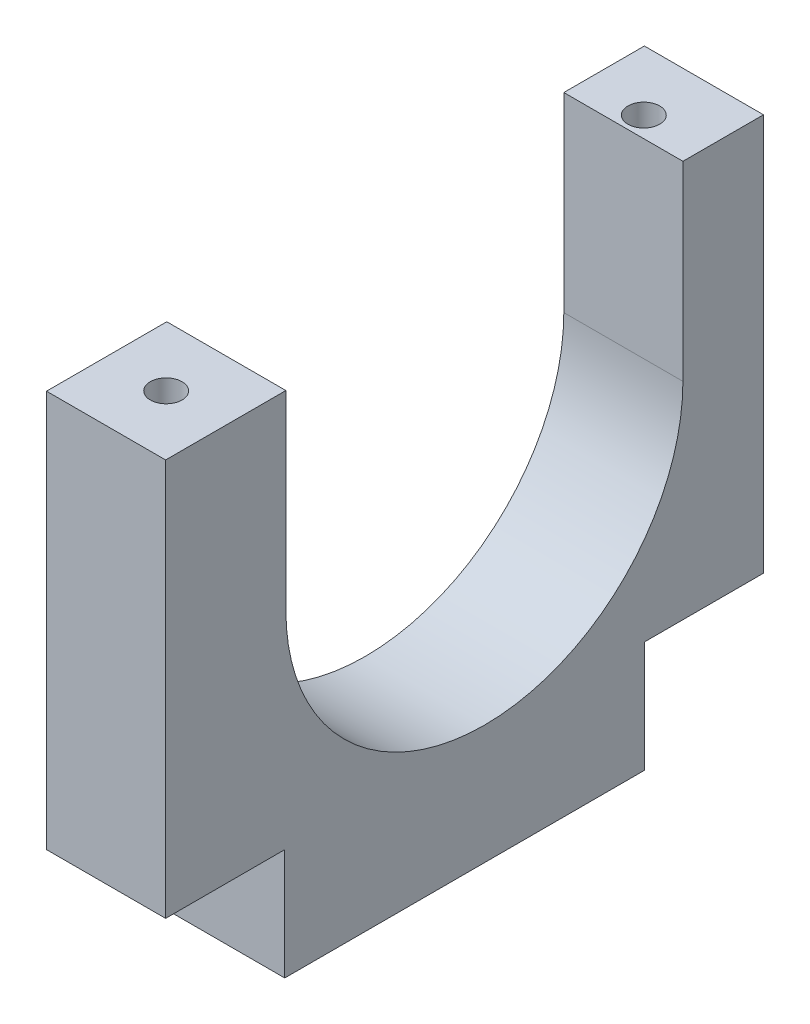
ISO-10303-21;
HEADER;
FILE_DESCRIPTION(('STEP AP214'),'2;1');
FILE_NAME('part.step','',(''),(''),'','','');
FILE_SCHEMA(('AUTOMOTIVE_DESIGN { 1 0 10303 214 1 1 1 1 }'));
ENDSEC;
DATA;
#1=APPLICATION_CONTEXT('core data for automotive mechanical design processes');
#2=APPLICATION_PROTOCOL_DEFINITION('international standard','automotive_design',2000,#1);
#3=PRODUCT_CONTEXT('',#1,'mechanical');
#4=PRODUCT('Part','Part','',(#3));
#5=PRODUCT_RELATED_PRODUCT_CATEGORY('part','',(#4));
#6=PRODUCT_DEFINITION_FORMATION('','',#4);
#7=PRODUCT_DEFINITION_CONTEXT('part definition',#1,'design');
#8=PRODUCT_DEFINITION('design','',#6,#7);
#9=PRODUCT_DEFINITION_SHAPE('','',#8);
#10=(LENGTH_UNIT() NAMED_UNIT(*) SI_UNIT(.MILLI.,.METRE.));
#11=(NAMED_UNIT(*) PLANE_ANGLE_UNIT() SI_UNIT($,.RADIAN.));
#12=(NAMED_UNIT(*) SI_UNIT($,.STERADIAN.) SOLID_ANGLE_UNIT());
#13=UNCERTAINTY_MEASURE_WITH_UNIT(LENGTH_MEASURE(1.E-05),#10,'distance_accuracy_value','');
#14=(GEOMETRIC_REPRESENTATION_CONTEXT(3) GLOBAL_UNCERTAINTY_ASSIGNED_CONTEXT((#13)) GLOBAL_UNIT_ASSIGNED_CONTEXT((#10,
#11,#12)) REPRESENTATION_CONTEXT('',''));
#15=CARTESIAN_POINT('',(0.,0.,0.));
#16=DIRECTION('',(0.,0.,1.));
#17=DIRECTION('',(1.,0.,0.));
#18=AXIS2_PLACEMENT_3D('',#15,#16,#17);
#19=CARTESIAN_POINT('',(0.,54.75,127.75));
#20=DIRECTION('',(0.,1.,0.));
#21=DIRECTION('',(0.,0.,-1.));
#22=AXIS2_PLACEMENT_3D('',#19,#20,#21);
#23=PLANE('',#22);
#24=CARTESIAN_POINT('',(-61.675,54.75,48.8374601018634));
#25=DIRECTION('',(0.,1.,0.));
#26=DIRECTION('',(0.,0.,1.));
#27=AXIS2_PLACEMENT_3D('',#24,#25,#26);
#28=CIRCLE('',#27,0.999999999999998);
#29=CARTESIAN_POINT('',(-61.675,54.75,49.8374601018634));
#30=VERTEX_POINT('',#29);
#31=EDGE_CURVE('E256',#30,#30,#28,.T.);
#32=ORIENTED_EDGE('',*,*,#31,.T.);
#33=EDGE_LOOP('',(#32));
#34=FACE_BOUND('',#33,.T.);
#35=CARTESIAN_POINT('',(-61.675,54.75,48.8374601018634));
#36=DIRECTION('',(0.,1.,0.));
#37=DIRECTION('',(0.,0.,1.));
#38=AXIS2_PLACEMENT_3D('',#35,#36,#37);
#39=CIRCLE('',#38,2.);
#40=CARTESIAN_POINT('',(-61.675,54.75,50.8374601018634));
#41=VERTEX_POINT('',#40);
#42=EDGE_CURVE('E11',#41,#41,#39,.T.);
#43=ORIENTED_EDGE('',*,*,#42,.F.);
#44=EDGE_LOOP('',(#43));
#45=FACE_BOUND('',#44,.T.);
#46=ADVANCED_FACE('F37',(#34,#45),#23,.F.);
#47=CARTESIAN_POINT('',(-57.925,54.75,52.5524601018634));
#48=DIRECTION('',(0.,0.,-1.));
#49=DIRECTION('',(-1.,0.,0.));
#50=AXIS2_PLACEMENT_3D('',#47,#48,#49);
#51=PLANE('',#50);
#52=DIRECTION('',(0.,-1.,0.));
#53=VECTOR('',#52,1.);
#54=CARTESIAN_POINT('',(-65.425,54.75,52.5524601018634));
#55=LINE('',#54,#53);
#56=CARTESIAN_POINT('',(-65.425,51.75,52.5524601018634));
#57=VERTEX_POINT('',#56);
#58=CARTESIAN_POINT('',(-65.425,44.75,52.5524601018634));
#59=VERTEX_POINT('',#58);
#60=EDGE_CURVE('E136',#57,#59,#55,.T.);
#61=ORIENTED_EDGE('',*,*,#60,.F.);
#62=DIRECTION('',(1.,0.,0.));
#63=VECTOR('',#62,1.);
#64=CARTESIAN_POINT('',(-57.925,51.75,52.5524601018634));
#65=LINE('',#64,#63);
#66=CARTESIAN_POINT('',(-57.925,51.75,52.5524601018634));
#67=VERTEX_POINT('',#66);
#68=EDGE_CURVE('E126',#57,#67,#65,.T.);
#69=ORIENTED_EDGE('',*,*,#68,.T.);
#70=DIRECTION('',(0.,-1.,0.));
#71=VECTOR('',#70,1.);
#72=CARTESIAN_POINT('',(-57.925,54.75,52.5524601018634));
#73=LINE('',#72,#71);
#74=CARTESIAN_POINT('',(-57.925,44.75,52.5524601018634));
#75=VERTEX_POINT('',#74);
#76=EDGE_CURVE('E59',#67,#75,#73,.T.);
#77=ORIENTED_EDGE('',*,*,#76,.T.);
#78=DIRECTION('',(1.,0.,0.));
#79=VECTOR('',#78,1.);
#80=CARTESIAN_POINT('',(-57.925,44.75,52.5524601018634));
#81=LINE('',#80,#79);
#82=EDGE_CURVE('E142',#59,#75,#81,.T.);
#83=ORIENTED_EDGE('',*,*,#82,.F.);
#84=EDGE_LOOP('',(#61,#69,#77,#83));
#85=FACE_BOUND('',#84,.T.);
#86=ADVANCED_FACE('F141',(#85),#51,.T.);
#87=CARTESIAN_POINT('',(0.,44.75,0.));
#88=DIRECTION('',(0.,1.,0.));
#89=DIRECTION('',(0.,0.,1.));
#90=AXIS2_PLACEMENT_3D('',#87,#88,#89);
#91=PLANE('',#90);
#92=ORIENTED_EDGE('',*,*,#82,.T.);
#93=DIRECTION('',(0.,0.,-1.));
#94=VECTOR('',#93,1.);
#95=CARTESIAN_POINT('',(-57.925,44.75,45.0524601018634));
#96=LINE('',#95,#94);
#97=CARTESIAN_POINT('',(-57.925,44.75,75.1975398981366));
#98=VERTEX_POINT('',#97);
#99=EDGE_CURVE('E218',#98,#75,#96,.T.);
#100=ORIENTED_EDGE('',*,*,#99,.F.);
#101=DIRECTION('',(1.,0.,0.));
#102=VECTOR('',#101,1.);
#103=CARTESIAN_POINT('',(-57.925,44.75,75.1975398981366));
#104=LINE('',#103,#102);
#105=CARTESIAN_POINT('',(-65.425,44.75,75.1975398981366));
#106=VERTEX_POINT('',#105);
#107=EDGE_CURVE('E170',#106,#98,#104,.T.);
#108=ORIENTED_EDGE('',*,*,#107,.F.);
#109=DIRECTION('',(0.,0.,-1.));
#110=VECTOR('',#109,1.);
#111=CARTESIAN_POINT('',(-65.425,44.75,45.0524601018634));
#112=LINE('',#111,#110);
#113=EDGE_CURVE('E216',#106,#59,#112,.T.);
#114=ORIENTED_EDGE('',*,*,#113,.T.);
#115=EDGE_LOOP('',(#92,#100,#108,#114));
#116=FACE_BOUND('',#115,.T.);
#117=ADVANCED_FACE('F279',(#116),#91,.F.);
#118=CARTESIAN_POINT('',(-57.925,54.75,75.1975398981366));
#119=DIRECTION('',(0.,0.,-1.));
#120=DIRECTION('',(-1.,0.,0.));
#121=AXIS2_PLACEMENT_3D('',#118,#119,#120);
#122=PLANE('',#121);
#123=DIRECTION('',(1.,0.,0.));
#124=VECTOR('',#123,1.);
#125=CARTESIAN_POINT('',(-57.925,51.75,75.1975398981366));
#126=LINE('',#125,#124);
#127=CARTESIAN_POINT('',(-65.425,51.75,75.1975398981366));
#128=VERTEX_POINT('',#127);
#129=CARTESIAN_POINT('',(-57.925,51.75,75.1975398981366));
#130=VERTEX_POINT('',#129);
#131=EDGE_CURVE('E164',#128,#130,#126,.T.);
#132=ORIENTED_EDGE('',*,*,#131,.F.);
#133=DIRECTION('',(0.,-1.,0.));
#134=VECTOR('',#133,1.);
#135=CARTESIAN_POINT('',(-65.425,54.75,75.1975398981366));
#136=LINE('',#135,#134);
#137=EDGE_CURVE('E173',#128,#106,#136,.T.);
#138=ORIENTED_EDGE('',*,*,#137,.T.);
#139=ORIENTED_EDGE('',*,*,#107,.T.);
#140=DIRECTION('',(0.,-1.,0.));
#141=VECTOR('',#140,1.);
#142=CARTESIAN_POINT('',(-57.925,54.75,75.1975398981366));
#143=LINE('',#142,#141);
#144=EDGE_CURVE('E174',#130,#98,#143,.T.);
#145=ORIENTED_EDGE('',*,*,#144,.F.);
#146=EDGE_LOOP('',(#132,#138,#139,#145));
#147=FACE_BOUND('',#146,.T.);
#148=ADVANCED_FACE('F295',(#147),#122,.F.);
#149=CARTESIAN_POINT('',(0.,54.75,0.));
#150=DIRECTION('',(0.,1.,0.));
#151=DIRECTION('',(0.,0.,1.));
#152=AXIS2_PLACEMENT_3D('',#149,#150,#151);
#153=PLANE('',#152);
#154=CARTESIAN_POINT('',(-61.675,54.75,78.9125398981366));
#155=DIRECTION('',(0.,-1.,0.));
#156=DIRECTION('',(0.,0.,-1.));
#157=AXIS2_PLACEMENT_3D('',#154,#155,#156);
#158=CIRCLE('',#157,0.999999999999998);
#159=CARTESIAN_POINT('',(-61.675,54.75,77.9125398981366));
#160=VERTEX_POINT('',#159);
#161=EDGE_CURVE('E167',#160,#160,#158,.T.);
#162=ORIENTED_EDGE('',*,*,#161,.F.);
#163=EDGE_LOOP('',(#162));
#164=FACE_BOUND('',#163,.T.);
#165=CARTESIAN_POINT('',(-61.675,54.75,78.9125398981366));
#166=DIRECTION('',(0.,-1.,0.));
#167=DIRECTION('',(0.,0.,-1.));
#168=AXIS2_PLACEMENT_3D('',#165,#166,#167);
#169=CIRCLE('',#168,2.);
#170=CARTESIAN_POINT('',(-61.675,54.75,76.9125398981366));
#171=VERTEX_POINT('',#170);
#172=EDGE_CURVE('E144',#171,#171,#169,.T.);
#173=ORIENTED_EDGE('',*,*,#172,.T.);
#174=EDGE_LOOP('',(#173));
#175=FACE_BOUND('',#174,.T.);
#176=ADVANCED_FACE('F292',(#164,#175),#153,.F.);
#177=CARTESIAN_POINT('',(-70.425,64.75,62.625));
#178=DIRECTION('',(1.,0.,0.));
#179=DIRECTION('',(0.,0.,-1.));
#180=AXIS2_PLACEMENT_3D('',#177,#178,#179);
#181=CYLINDRICAL_SURFACE('',#180,12.5);
#182=DIRECTION('',(1.,0.,0.));
#183=VECTOR('',#182,1.);
#184=CARTESIAN_POINT('',(-70.425,64.75,75.125));
#185=LINE('',#184,#183);
#186=CARTESIAN_POINT('',(-65.425,64.75,75.125));
#187=VERTEX_POINT('',#186);
#188=CARTESIAN_POINT('',(-57.925,64.75,75.125));
#189=VERTEX_POINT('',#188);
#190=EDGE_CURVE('E229',#187,#189,#185,.T.);
#191=ORIENTED_EDGE('',*,*,#190,.T.);
#192=CARTESIAN_POINT('',(-57.925,64.75,62.625));
#193=DIRECTION('',(-1.,0.,0.));
#194=DIRECTION('',(0.,0.,1.));
#195=AXIS2_PLACEMENT_3D('',#192,#193,#194);
#196=CIRCLE('',#195,12.5);
#197=CARTESIAN_POINT('',(-57.925,64.75,50.125));
#198=VERTEX_POINT('',#197);
#199=EDGE_CURVE('E221',#198,#189,#196,.T.);
#200=ORIENTED_EDGE('',*,*,#199,.F.);
#201=DIRECTION('',(1.,0.,0.));
#202=VECTOR('',#201,1.);
#203=CARTESIAN_POINT('',(-70.425,64.75,50.125));
#204=LINE('',#203,#202);
#205=CARTESIAN_POINT('',(-65.425,64.75,50.125));
#206=VERTEX_POINT('',#205);
#207=EDGE_CURVE('E45',#198,#206,#204,.F.);
#208=ORIENTED_EDGE('',*,*,#207,.T.);
#209=CARTESIAN_POINT('',(-65.425,64.75,62.625));
#210=DIRECTION('',(-1.,0.,0.));
#211=DIRECTION('',(0.,0.,1.));
#212=AXIS2_PLACEMENT_3D('',#209,#210,#211);
#213=CIRCLE('',#212,12.5);
#214=EDGE_CURVE('E224',#187,#206,#213,.F.);
#215=ORIENTED_EDGE('',*,*,#214,.F.);
#216=EDGE_LOOP('',(#191,#200,#208,#215));
#217=FACE_BOUND('',#216,.T.);
#218=ADVANCED_FACE('F237',(#217),#181,.F.);
#219=CARTESIAN_POINT('',(-65.425,-35.9364248901641,45.0524601018634));
#220=DIRECTION('',(0.,0.,1.));
#221=DIRECTION('',(1.,0.,0.));
#222=AXIS2_PLACEMENT_3D('',#219,#220,#221);
#223=PLANE('',#222);
#224=DIRECTION('',(0.,1.,0.));
#225=VECTOR('',#224,1.);
#226=CARTESIAN_POINT('',(-57.925,-35.9364248901641,45.0524601018634));
#227=LINE('',#226,#225);
#228=CARTESIAN_POINT('',(-57.925,51.75,45.0524601018634));
#229=VERTEX_POINT('',#228);
#230=CARTESIAN_POINT('',(-57.925,76.75,45.0524601018634));
#231=VERTEX_POINT('',#230);
#232=EDGE_CURVE('E227',#229,#231,#227,.T.);
#233=ORIENTED_EDGE('',*,*,#232,.F.);
#234=DIRECTION('',(-1.,0.,0.));
#235=VECTOR('',#234,1.);
#236=CARTESIAN_POINT('',(-57.925,51.75,45.0524601018634));
#237=LINE('',#236,#235);
#238=CARTESIAN_POINT('',(-65.425,51.75,45.0524601018634));
#239=VERTEX_POINT('',#238);
#240=EDGE_CURVE('E139',#229,#239,#237,.T.);
#241=ORIENTED_EDGE('',*,*,#240,.T.);
#242=DIRECTION('',(0.,1.,0.));
#243=VECTOR('',#242,1.);
#244=CARTESIAN_POINT('',(-65.425,-35.9364248901641,45.0524601018634));
#245=LINE('',#244,#243);
#246=CARTESIAN_POINT('',(-65.425,76.75,45.0524601018634));
#247=VERTEX_POINT('',#246);
#248=EDGE_CURVE('E138',#239,#247,#245,.T.);
#249=ORIENTED_EDGE('',*,*,#248,.T.);
#250=DIRECTION('',(-1.,0.,0.));
#251=VECTOR('',#250,1.);
#252=CARTESIAN_POINT('',(-57.925,76.75,45.0524601018634));
#253=LINE('',#252,#251);
#254=EDGE_CURVE('E193',#231,#247,#253,.T.);
#255=ORIENTED_EDGE('',*,*,#254,.F.);
#256=EDGE_LOOP('',(#233,#241,#249,#255));
#257=FACE_BOUND('',#256,.T.);
#258=ADVANCED_FACE('F255',(#257),#223,.F.);
#259=CARTESIAN_POINT('',(-65.425,-35.9364248901641,45.0524601018634));
#260=DIRECTION('',(-1.,0.,0.));
#261=DIRECTION('',(0.,0.,1.));
#262=AXIS2_PLACEMENT_3D('',#259,#260,#261);
#263=PLANE('',#262);
#264=ORIENTED_EDGE('',*,*,#248,.F.);
#265=DIRECTION('',(0.,0.,1.));
#266=VECTOR('',#265,1.);
#267=CARTESIAN_POINT('',(-65.425,51.75,45.0524601018634));
#268=LINE('',#267,#266);
#269=EDGE_CURVE('E129',#239,#57,#268,.T.);
#270=ORIENTED_EDGE('',*,*,#269,.T.);
#271=ORIENTED_EDGE('',*,*,#60,.T.);
#272=ORIENTED_EDGE('',*,*,#113,.F.);
#273=ORIENTED_EDGE('',*,*,#137,.F.);
#274=DIRECTION('',(0.,0.,-1.));
#275=VECTOR('',#274,1.);
#276=CARTESIAN_POINT('',(-65.425,51.75,82.6975398981366));
#277=LINE('',#276,#275);
#278=CARTESIAN_POINT('',(-65.425,51.75,82.6975398981366));
#279=VERTEX_POINT('',#278);
#280=EDGE_CURVE('E161',#279,#128,#277,.T.);
#281=ORIENTED_EDGE('',*,*,#280,.F.);
#282=DIRECTION('',(0.,-1.,0.));
#283=VECTOR('',#282,1.);
#284=CARTESIAN_POINT('',(-65.425,84.655694150421,82.6975398981366));
#285=LINE('',#284,#283);
#286=CARTESIAN_POINT('',(-65.425,76.75,82.6975398981366));
#287=VERTEX_POINT('',#286);
#288=EDGE_CURVE('E183',#287,#279,#285,.T.);
#289=ORIENTED_EDGE('',*,*,#288,.F.);
#290=DIRECTION('',(0.,0.,1.));
#291=VECTOR('',#290,1.);
#292=CARTESIAN_POINT('',(-65.425,76.75,80.1975398981366));
#293=LINE('',#292,#291);
#294=CARTESIAN_POINT('',(-65.425,76.75,75.125));
#295=VERTEX_POINT('',#294);
#296=EDGE_CURVE('E209',#295,#287,#293,.T.);
#297=ORIENTED_EDGE('',*,*,#296,.F.);
#298=DIRECTION('',(0.,-1.,0.));
#299=VECTOR('',#298,1.);
#300=CARTESIAN_POINT('',(-65.425,76.75,75.125));
#301=LINE('',#300,#299);
#302=EDGE_CURVE('E211',#295,#187,#301,.T.);
#303=ORIENTED_EDGE('',*,*,#302,.T.);
#304=ORIENTED_EDGE('',*,*,#214,.T.);
#305=DIRECTION('',(0.,-1.,0.));
#306=VECTOR('',#305,1.);
#307=CARTESIAN_POINT('',(-65.425,76.75,50.125));
#308=LINE('',#307,#306);
#309=CARTESIAN_POINT('',(-65.425,76.75,50.125));
#310=VERTEX_POINT('',#309);
#311=EDGE_CURVE('E202',#310,#206,#308,.T.);
#312=ORIENTED_EDGE('',*,*,#311,.F.);
#313=DIRECTION('',(0.,0.,1.));
#314=VECTOR('',#313,1.);
#315=CARTESIAN_POINT('',(-65.425,76.75,50.125));
#316=LINE('',#315,#314);
#317=EDGE_CURVE('E196',#247,#310,#316,.T.);
#318=ORIENTED_EDGE('',*,*,#317,.F.);
#319=EDGE_LOOP('',(#264,#270,#271,#272,#273,#281,#289,#297,#303,#304,#312,#318));
#320=FACE_BOUND('',#319,.T.);
#321=ADVANCED_FACE('F134',(#320),#263,.T.);
#322=CARTESIAN_POINT('',(-57.925,-35.9364248901641,45.0524601018634));
#323=DIRECTION('',(-1.,0.,0.));
#324=DIRECTION('',(0.,0.,1.));
#325=AXIS2_PLACEMENT_3D('',#322,#323,#324);
#326=PLANE('',#325);
#327=DIRECTION('',(0.,0.,-1.));
#328=VECTOR('',#327,1.);
#329=CARTESIAN_POINT('',(-57.925,51.75,45.0524601018634));
#330=LINE('',#329,#328);
#331=EDGE_CURVE('E52',#67,#229,#330,.T.);
#332=ORIENTED_EDGE('',*,*,#331,.T.);
#333=ORIENTED_EDGE('',*,*,#232,.T.);
#334=DIRECTION('',(0.,0.,-1.));
#335=VECTOR('',#334,1.);
#336=CARTESIAN_POINT('',(-57.925,76.75,50.125));
#337=LINE('',#336,#335);
#338=CARTESIAN_POINT('',(-57.925,76.75,50.125));
#339=VERTEX_POINT('',#338);
#340=EDGE_CURVE('E187',#339,#231,#337,.T.);
#341=ORIENTED_EDGE('',*,*,#340,.F.);
#342=DIRECTION('',(0.,-1.,0.));
#343=VECTOR('',#342,1.);
#344=CARTESIAN_POINT('',(-57.925,76.75,50.125));
#345=LINE('',#344,#343);
#346=EDGE_CURVE('E200',#339,#198,#345,.T.);
#347=ORIENTED_EDGE('',*,*,#346,.T.);
#348=ORIENTED_EDGE('',*,*,#199,.T.);
#349=DIRECTION('',(0.,-1.,0.));
#350=VECTOR('',#349,1.);
#351=CARTESIAN_POINT('',(-57.925,76.75,75.125));
#352=LINE('',#351,#350);
#353=CARTESIAN_POINT('',(-57.925,76.75,75.125));
#354=VERTEX_POINT('',#353);
#355=EDGE_CURVE('E214',#354,#189,#352,.T.);
#356=ORIENTED_EDGE('',*,*,#355,.F.);
#357=DIRECTION('',(0.,0.,-1.));
#358=VECTOR('',#357,1.);
#359=CARTESIAN_POINT('',(-57.925,76.75,80.1975398981366));
#360=LINE('',#359,#358);
#361=CARTESIAN_POINT('',(-57.925,76.75,82.6975398981366));
#362=VERTEX_POINT('',#361);
#363=EDGE_CURVE('E204',#362,#354,#360,.T.);
#364=ORIENTED_EDGE('',*,*,#363,.F.);
#365=DIRECTION('',(0.,-1.,0.));
#366=VECTOR('',#365,1.);
#367=CARTESIAN_POINT('',(-57.925,84.655694150421,82.6975398981366));
#368=LINE('',#367,#366);
#369=CARTESIAN_POINT('',(-57.925,51.75,82.6975398981366));
#370=VERTEX_POINT('',#369);
#371=EDGE_CURVE('E188',#362,#370,#368,.T.);
#372=ORIENTED_EDGE('',*,*,#371,.T.);
#373=DIRECTION('',(0.,0.,1.));
#374=VECTOR('',#373,1.);
#375=CARTESIAN_POINT('',(-57.925,51.75,82.6975398981366));
#376=LINE('',#375,#374);
#377=EDGE_CURVE('E154',#130,#370,#376,.T.);
#378=ORIENTED_EDGE('',*,*,#377,.F.);
#379=ORIENTED_EDGE('',*,*,#144,.T.);
#380=ORIENTED_EDGE('',*,*,#99,.T.);
#381=ORIENTED_EDGE('',*,*,#76,.F.);
#382=EDGE_LOOP('',(#332,#333,#341,#347,#348,#356,#364,#372,#378,#379,#380,#381));
#383=FACE_BOUND('',#382,.T.);
#384=ADVANCED_FACE('F39',(#383),#326,.F.);
#385=CARTESIAN_POINT('',(-57.925,76.75,75.125));
#386=DIRECTION('',(0.,0.,1.));
#387=DIRECTION('',(1.,0.,0.));
#388=AXIS2_PLACEMENT_3D('',#385,#386,#387);
#389=PLANE('',#388);
#390=ORIENTED_EDGE('',*,*,#190,.F.);
#391=ORIENTED_EDGE('',*,*,#302,.F.);
#392=DIRECTION('',(-1.,0.,0.));
#393=VECTOR('',#392,1.);
#394=CARTESIAN_POINT('',(-57.925,76.75,75.125));
#395=LINE('',#394,#393);
#396=EDGE_CURVE('E207',#354,#295,#395,.T.);
#397=ORIENTED_EDGE('',*,*,#396,.F.);
#398=ORIENTED_EDGE('',*,*,#355,.T.);
#399=EDGE_LOOP('',(#390,#391,#397,#398));
#400=FACE_BOUND('',#399,.T.);
#401=ADVANCED_FACE('F246',(#400),#389,.F.);
#402=CARTESIAN_POINT('',(0.,76.75,0.));
#403=DIRECTION('',(0.,1.,0.));
#404=DIRECTION('',(0.,0.,1.));
#405=AXIS2_PLACEMENT_3D('',#402,#403,#404);
#406=PLANE('',#405);
#407=CARTESIAN_POINT('',(-61.675,76.75,78.9125398981366));
#408=DIRECTION('',(0.,-1.,0.));
#409=DIRECTION('',(0.,0.,-1.));
#410=AXIS2_PLACEMENT_3D('',#407,#408,#409);
#411=CIRCLE('',#410,0.999999999999998);
#412=CARTESIAN_POINT('',(-61.675,76.75,77.9125398981366));
#413=VERTEX_POINT('',#412);
#414=EDGE_CURVE('E180',#413,#413,#411,.T.);
#415=ORIENTED_EDGE('',*,*,#414,.T.);
#416=EDGE_LOOP('',(#415));
#417=FACE_BOUND('',#416,.T.);
#418=ORIENTED_EDGE('',*,*,#363,.T.);
#419=ORIENTED_EDGE('',*,*,#396,.T.);
#420=ORIENTED_EDGE('',*,*,#296,.T.);
#421=DIRECTION('',(1.,0.,0.));
#422=VECTOR('',#421,1.);
#423=CARTESIAN_POINT('',(0.,76.75,82.6975398981366));
#424=LINE('',#423,#422);
#425=EDGE_CURVE('E184',#287,#362,#424,.T.);
#426=ORIENTED_EDGE('',*,*,#425,.T.);
#427=EDGE_LOOP('',(#418,#419,#420,#426));
#428=FACE_BOUND('',#427,.T.);
#429=ADVANCED_FACE('F316',(#417,#428),#406,.T.);
#430=CARTESIAN_POINT('',(-57.925,76.75,50.125));
#431=DIRECTION('',(0.,0.,-1.));
#432=DIRECTION('',(-1.,0.,0.));
#433=AXIS2_PLACEMENT_3D('',#430,#431,#432);
#434=PLANE('',#433);
#435=ORIENTED_EDGE('',*,*,#207,.F.);
#436=ORIENTED_EDGE('',*,*,#346,.F.);
#437=DIRECTION('',(1.,0.,0.));
#438=VECTOR('',#437,1.);
#439=CARTESIAN_POINT('',(-57.925,76.75,50.125));
#440=LINE('',#439,#438);
#441=EDGE_CURVE('E198',#310,#339,#440,.T.);
#442=ORIENTED_EDGE('',*,*,#441,.F.);
#443=ORIENTED_EDGE('',*,*,#311,.T.);
#444=EDGE_LOOP('',(#435,#436,#442,#443));
#445=FACE_BOUND('',#444,.T.);
#446=ADVANCED_FACE('F250',(#445),#434,.F.);
#447=CARTESIAN_POINT('',(0.,76.75,0.));
#448=DIRECTION('',(0.,1.,0.));
#449=DIRECTION('',(0.,0.,1.));
#450=AXIS2_PLACEMENT_3D('',#447,#448,#449);
#451=PLANE('',#450);
#452=CARTESIAN_POINT('',(-61.675,76.75,48.8374601018634));
#453=DIRECTION('',(0.,1.,0.));
#454=DIRECTION('',(0.,0.,1.));
#455=AXIS2_PLACEMENT_3D('',#452,#453,#454);
#456=CIRCLE('',#455,0.999999999999998);
#457=CARTESIAN_POINT('',(-61.675,76.75,49.8374601018634));
#458=VERTEX_POINT('',#457);
#459=EDGE_CURVE('E176',#458,#458,#456,.T.);
#460=ORIENTED_EDGE('',*,*,#459,.F.);
#461=EDGE_LOOP('',(#460));
#462=FACE_BOUND('',#461,.T.);
#463=ORIENTED_EDGE('',*,*,#340,.T.);
#464=ORIENTED_EDGE('',*,*,#254,.T.);
#465=ORIENTED_EDGE('',*,*,#317,.T.);
#466=ORIENTED_EDGE('',*,*,#441,.T.);
#467=EDGE_LOOP('',(#463,#464,#465,#466));
#468=FACE_BOUND('',#467,.T.);
#469=ADVANCED_FACE('F252',(#462,#468),#451,.T.);
#470=CARTESIAN_POINT('',(0.,84.655694150421,82.6975398981366));
#471=DIRECTION('',(0.,0.,-1.));
#472=DIRECTION('',(-1.,0.,0.));
#473=AXIS2_PLACEMENT_3D('',#470,#471,#472);
#474=PLANE('',#473);
#475=ORIENTED_EDGE('',*,*,#288,.T.);
#476=DIRECTION('',(-1.,0.,0.));
#477=VECTOR('',#476,1.);
#478=CARTESIAN_POINT('',(-57.925,51.75,82.6975398981366));
#479=LINE('',#478,#477);
#480=EDGE_CURVE('E158',#370,#279,#479,.T.);
#481=ORIENTED_EDGE('',*,*,#480,.F.);
#482=ORIENTED_EDGE('',*,*,#371,.F.);
#483=ORIENTED_EDGE('',*,*,#425,.F.);
#484=EDGE_LOOP('',(#475,#481,#482,#483));
#485=FACE_BOUND('',#484,.T.);
#486=ADVANCED_FACE('F306',(#485),#474,.F.);
#487=CARTESIAN_POINT('',(-61.675,76.75,78.9125398981366));
#488=DIRECTION('',(0.,-1.,0.));
#489=DIRECTION('',(0.,0.,-1.));
#490=AXIS2_PLACEMENT_3D('',#487,#488,#489);
#491=CYLINDRICAL_SURFACE('',#490,0.999999999999998);
#492=ORIENTED_EDGE('',*,*,#161,.T.);
#493=EDGE_LOOP('',(#492));
#494=FACE_BOUND('',#493,.T.);
#495=ORIENTED_EDGE('',*,*,#414,.F.);
#496=EDGE_LOOP('',(#495));
#497=FACE_BOUND('',#496,.T.);
#498=ADVANCED_FACE('F302',(#494,#497),#491,.F.);
#499=CARTESIAN_POINT('',(-61.675,76.75,48.8374601018634));
#500=DIRECTION('',(0.,-1.,0.));
#501=DIRECTION('',(0.,0.,-1.));
#502=AXIS2_PLACEMENT_3D('',#499,#500,#501);
#503=CYLINDRICAL_SURFACE('',#502,0.999999999999998);
#504=ORIENTED_EDGE('',*,*,#31,.F.);
#505=EDGE_LOOP('',(#504));
#506=FACE_BOUND('',#505,.T.);
#507=ORIENTED_EDGE('',*,*,#459,.T.);
#508=EDGE_LOOP('',(#507));
#509=FACE_BOUND('',#508,.T.);
#510=ADVANCED_FACE('F290',(#506,#509),#503,.F.);
#511=CARTESIAN_POINT('',(0.,51.75,0.));
#512=DIRECTION('',(0.,1.,0.));
#513=DIRECTION('',(0.,0.,1.));
#514=AXIS2_PLACEMENT_3D('',#511,#512,#513);
#515=PLANE('',#514);
#516=ORIENTED_EDGE('',*,*,#377,.T.);
#517=ORIENTED_EDGE('',*,*,#480,.T.);
#518=ORIENTED_EDGE('',*,*,#280,.T.);
#519=ORIENTED_EDGE('',*,*,#131,.T.);
#520=EDGE_LOOP('',(#516,#517,#518,#519));
#521=FACE_BOUND('',#520,.T.);
#522=CARTESIAN_POINT('',(-61.675,51.75,78.9125398981366));
#523=DIRECTION('',(0.,-1.,0.));
#524=DIRECTION('',(0.,0.,-1.));
#525=AXIS2_PLACEMENT_3D('',#522,#523,#524);
#526=CIRCLE('',#525,2.);
#527=CARTESIAN_POINT('',(-61.675,51.75,76.9125398981366));
#528=VERTEX_POINT('',#527);
#529=EDGE_CURVE('E147',#528,#528,#526,.T.);
#530=ORIENTED_EDGE('',*,*,#529,.F.);
#531=EDGE_LOOP('',(#530));
#532=FACE_BOUND('',#531,.T.);
#533=ADVANCED_FACE('F286',(#521,#532),#515,.F.);
#534=CARTESIAN_POINT('',(-61.675,51.75,78.9125398981366));
#535=DIRECTION('',(0.,1.,0.));
#536=DIRECTION('',(0.,0.,1.));
#537=AXIS2_PLACEMENT_3D('',#534,#535,#536);
#538=CYLINDRICAL_SURFACE('',#537,2.);
#539=ORIENTED_EDGE('',*,*,#529,.T.);
#540=EDGE_LOOP('',(#539));
#541=FACE_BOUND('',#540,.T.);
#542=ORIENTED_EDGE('',*,*,#172,.F.);
#543=EDGE_LOOP('',(#542));
#544=FACE_BOUND('',#543,.T.);
#545=ADVANCED_FACE('F283',(#541,#544),#538,.F.);
#546=CARTESIAN_POINT('',(0.,51.75,127.75));
#547=DIRECTION('',(0.,1.,0.));
#548=DIRECTION('',(0.,0.,-1.));
#549=AXIS2_PLACEMENT_3D('',#546,#547,#548);
#550=PLANE('',#549);
#551=CARTESIAN_POINT('',(-61.675,51.75,48.8374601018634));
#552=DIRECTION('',(0.,1.,0.));
#553=DIRECTION('',(0.,0.,1.));
#554=AXIS2_PLACEMENT_3D('',#551,#552,#553);
#555=CIRCLE('',#554,2.);
#556=CARTESIAN_POINT('',(-61.675,51.75,50.8374601018634));
#557=VERTEX_POINT('',#556);
#558=EDGE_CURVE('E261',#557,#557,#555,.T.);
#559=ORIENTED_EDGE('',*,*,#558,.T.);
#560=EDGE_LOOP('',(#559));
#561=FACE_BOUND('',#560,.T.);
#562=ORIENTED_EDGE('',*,*,#331,.F.);
#563=ORIENTED_EDGE('',*,*,#68,.F.);
#564=ORIENTED_EDGE('',*,*,#269,.F.);
#565=ORIENTED_EDGE('',*,*,#240,.F.);
#566=EDGE_LOOP('',(#562,#563,#564,#565));
#567=FACE_BOUND('',#566,.T.);
#568=ADVANCED_FACE('F128',(#561,#567),#550,.F.);
#569=CARTESIAN_POINT('',(-61.675,51.75,48.8374601018634));
#570=DIRECTION('',(0.,1.,0.));
#571=DIRECTION('',(0.,0.,1.));
#572=AXIS2_PLACEMENT_3D('',#569,#570,#571);
#573=CYLINDRICAL_SURFACE('',#572,2.);
#574=ORIENTED_EDGE('',*,*,#558,.F.);
#575=EDGE_LOOP('',(#574));
#576=FACE_BOUND('',#575,.T.);
#577=ORIENTED_EDGE('',*,*,#42,.T.);
#578=EDGE_LOOP('',(#577));
#579=FACE_BOUND('',#578,.T.);
#580=ADVANCED_FACE('F266',(#576,#579),#573,.F.);
#581=CLOSED_SHELL('',(#46,#86,#117,#148,#176,#218,#258,#321,#384,#401,#429,#446,#469,#486,#498,
#510,#533,#545,#568,#580));
#582=MANIFOLD_SOLID_BREP('B2',#581);
#583=ADVANCED_BREP_SHAPE_REPRESENTATION('',(#18,#582),#14);
#584=SHAPE_DEFINITION_REPRESENTATION(#9,#583);
ENDSEC;
END-ISO-10303-21;
